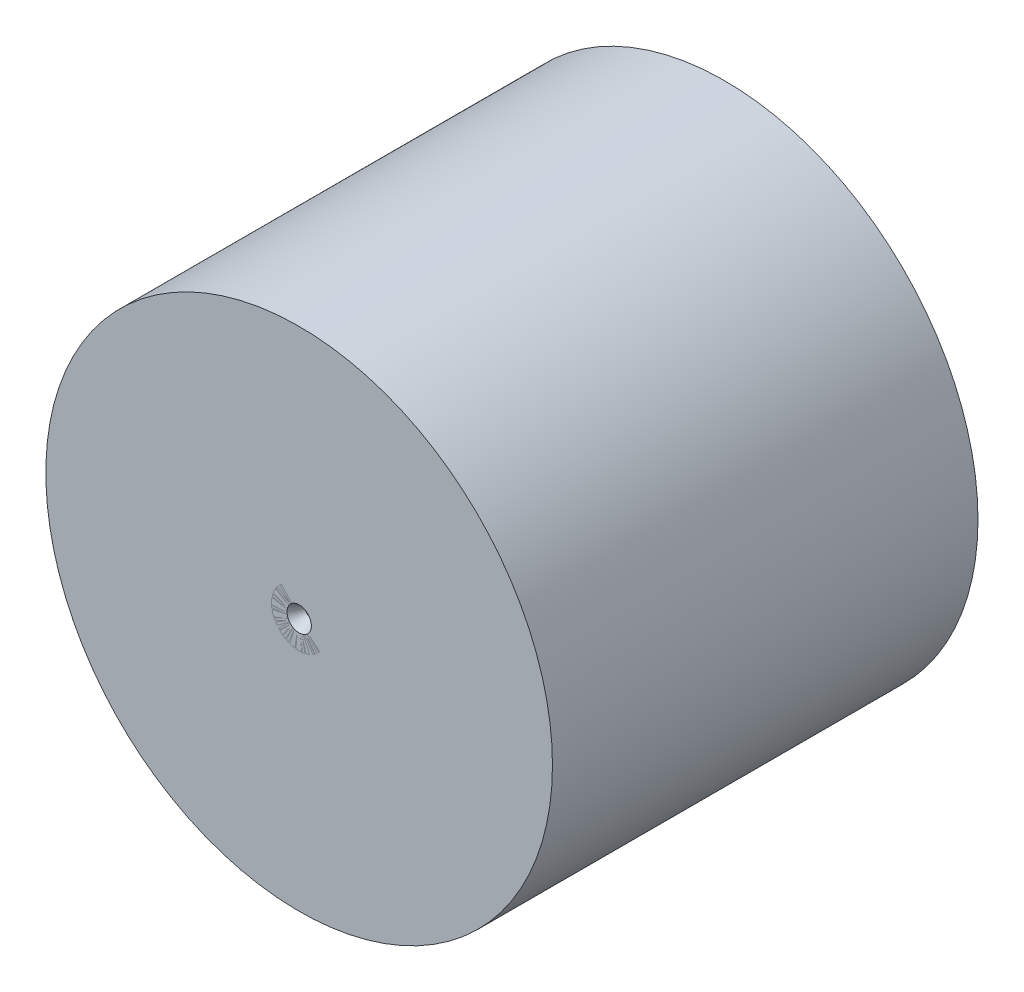
ISO-10303-21;
HEADER;
FILE_DESCRIPTION(('STEP AP214'),'2;1');
FILE_NAME('part.step','',(''),(''),'','','');
FILE_SCHEMA(('AUTOMOTIVE_DESIGN { 1 0 10303 214 1 1 1 1 }'));
ENDSEC;
DATA;
#1=APPLICATION_CONTEXT('core data for automotive mechanical design processes');
#2=APPLICATION_PROTOCOL_DEFINITION('international standard','automotive_design',2000,#1);
#3=PRODUCT_CONTEXT('',#1,'mechanical');
#4=PRODUCT('Part','Part','',(#3));
#5=PRODUCT_RELATED_PRODUCT_CATEGORY('part','',(#4));
#6=PRODUCT_DEFINITION_FORMATION('','',#4);
#7=PRODUCT_DEFINITION_CONTEXT('part definition',#1,'design');
#8=PRODUCT_DEFINITION('design','',#6,#7);
#9=PRODUCT_DEFINITION_SHAPE('','',#8);
#10=(LENGTH_UNIT() NAMED_UNIT(*) SI_UNIT(.MILLI.,.METRE.));
#11=(NAMED_UNIT(*) PLANE_ANGLE_UNIT() SI_UNIT($,.RADIAN.));
#12=(NAMED_UNIT(*) SI_UNIT($,.STERADIAN.) SOLID_ANGLE_UNIT());
#13=UNCERTAINTY_MEASURE_WITH_UNIT(LENGTH_MEASURE(1.E-05),#10,'distance_accuracy_value','');
#14=(GEOMETRIC_REPRESENTATION_CONTEXT(3) GLOBAL_UNCERTAINTY_ASSIGNED_CONTEXT((#13)) GLOBAL_UNIT_ASSIGNED_CONTEXT((#10,
#11,#12)) REPRESENTATION_CONTEXT('',''));
#15=CARTESIAN_POINT('',(0.,0.,0.));
#16=DIRECTION('',(0.,0.,1.));
#17=DIRECTION('',(1.,0.,0.));
#18=AXIS2_PLACEMENT_3D('',#15,#16,#17);
#19=CARTESIAN_POINT('',(0.,0.,-165.644610179245));
#20=DIRECTION('',(0.,0.,1.));
#21=DIRECTION('',(1.,0.,0.));
#22=AXIS2_PLACEMENT_3D('',#19,#20,#21);
#23=CYLINDRICAL_SURFACE('',#22,57.15);
#24=CARTESIAN_POINT('',(0.,0.,-2.));
#25=DIRECTION('',(0.,0.,1.));
#26=DIRECTION('',(1.,0.,0.));
#27=AXIS2_PLACEMENT_3D('',#24,#25,#26);
#28=CIRCLE('',#27,57.15);
#29=CARTESIAN_POINT('',(57.15,0.,-2.));
#30=VERTEX_POINT('',#29);
#31=EDGE_CURVE('E76',#30,#30,#28,.F.);
#32=CARTESIAN_POINT('',(0.,0.,93.9999996618));
#33=DIRECTION('',(0.,0.,1.));
#34=DIRECTION('',(1.,0.,0.));
#35=AXIS2_PLACEMENT_3D('',#32,#33,#34);
#36=CIRCLE('',#35,57.15);
#37=CARTESIAN_POINT('',(57.15,0.,93.9999996618));
#38=VERTEX_POINT('',#37);
#39=EDGE_CURVE('E14',#38,#38,#36,.F.);
#40=CARTESIAN_POINT('',(57.15,0.,-2.));
#41=CARTESIAN_POINT('',(57.15,0.,-1.00000000352291));
#42=CARTESIAN_POINT('',(57.15,0.,-7.04582681261556E-09));
#43=CARTESIAN_POINT('',(57.15,0.,1.99999998590834));
#44=CARTESIAN_POINT('',(57.15,0.,2.99999998238542));
#45=CARTESIAN_POINT('',(57.15,0.,4.99999997533958));
#46=CARTESIAN_POINT('',(57.15,0.,5.99999997181667));
#47=CARTESIAN_POINT('',(57.15,0.,7.99999996477084));
#48=CARTESIAN_POINT('',(57.15,0.,8.99999996124791));
#49=CARTESIAN_POINT('',(57.15,0.,10.9999999542021));
#50=CARTESIAN_POINT('',(57.15,0.,11.9999999506792));
#51=CARTESIAN_POINT('',(57.15,0.,13.9999999436333));
#52=CARTESIAN_POINT('',(57.15,0.,14.9999999401104));
#53=CARTESIAN_POINT('',(57.15,0.,16.9999999330646));
#54=CARTESIAN_POINT('',(57.15,0.,17.9999999295417));
#55=CARTESIAN_POINT('',(57.15,0.,19.9999999224958));
#56=CARTESIAN_POINT('',(57.15,0.,20.9999999189729));
#57=CARTESIAN_POINT('',(57.15,0.,22.9999999119271));
#58=CARTESIAN_POINT('',(57.15,0.,23.9999999084042));
#59=CARTESIAN_POINT('',(57.15,0.,25.9999999013584));
#60=CARTESIAN_POINT('',(57.15,0.,26.9999998978354));
#61=CARTESIAN_POINT('',(57.15,0.,28.9999998907896));
#62=CARTESIAN_POINT('',(57.15,0.,29.9999998872667));
#63=CARTESIAN_POINT('',(57.15,0.,31.9999998802209));
#64=CARTESIAN_POINT('',(57.15,0.,32.9999998766979));
#65=CARTESIAN_POINT('',(57.15,0.,34.9999998696521));
#66=CARTESIAN_POINT('',(57.15,0.,35.9999998661292));
#67=CARTESIAN_POINT('',(57.15,0.,37.9999998590834));
#68=CARTESIAN_POINT('',(57.15,0.,38.9999998555604));
#69=CARTESIAN_POINT('',(57.15,0.,40.9999998485146));
#70=CARTESIAN_POINT('',(57.15,0.,41.9999998449917));
#71=CARTESIAN_POINT('',(57.15,0.,43.9999998379459));
#72=CARTESIAN_POINT('',(57.15,0.,44.999999834423));
#73=CARTESIAN_POINT('',(57.15,0.,46.9999998273771));
#74=CARTESIAN_POINT('',(57.15,0.,47.9999998238542));
#75=CARTESIAN_POINT('',(57.15,0.,49.9999998168084));
#76=CARTESIAN_POINT('',(57.15,0.,50.9999998132854));
#77=CARTESIAN_POINT('',(57.15,0.,52.9999998062396));
#78=CARTESIAN_POINT('',(57.15,0.,53.9999998027167));
#79=CARTESIAN_POINT('',(57.15,0.,55.9999997956709));
#80=CARTESIAN_POINT('',(57.15,0.,56.9999997921479));
#81=CARTESIAN_POINT('',(57.15,0.,58.9999997851021));
#82=CARTESIAN_POINT('',(57.15,0.,59.9999997815792));
#83=CARTESIAN_POINT('',(57.15,0.,61.9999997745334));
#84=CARTESIAN_POINT('',(57.15,0.,62.9999997710105));
#85=CARTESIAN_POINT('',(57.15,0.,64.9999997639646));
#86=CARTESIAN_POINT('',(57.15,0.,65.9999997604417));
#87=CARTESIAN_POINT('',(57.15,0.,67.9999997533959));
#88=CARTESIAN_POINT('',(57.15,0.,68.999999749873));
#89=CARTESIAN_POINT('',(57.15,0.,70.9999997428271));
#90=CARTESIAN_POINT('',(57.15,0.,71.9999997393042));
#91=CARTESIAN_POINT('',(57.15,0.,73.9999997322584));
#92=CARTESIAN_POINT('',(57.15,0.,74.9999997287355));
#93=CARTESIAN_POINT('',(57.15,0.,76.9999997216896));
#94=CARTESIAN_POINT('',(57.15,0.,77.9999997181667));
#95=CARTESIAN_POINT('',(57.15,0.,79.9999997111209));
#96=CARTESIAN_POINT('',(57.15,0.,80.999999707598));
#97=CARTESIAN_POINT('',(57.15,0.,82.9999997005521));
#98=CARTESIAN_POINT('',(57.15,0.,83.9999996970292));
#99=CARTESIAN_POINT('',(57.15,0.,85.9999996899834));
#100=CARTESIAN_POINT('',(57.15,0.,86.9999996864605));
#101=CARTESIAN_POINT('',(57.15,0.,88.9999996794146));
#102=CARTESIAN_POINT('',(57.15,0.,89.9999996758917));
#103=CARTESIAN_POINT('',(57.15,0.,91.9999996688459));
#104=CARTESIAN_POINT('',(57.15,0.,92.9999996653229));
#105=CARTESIAN_POINT('',(57.15,0.,93.9999996618));
#106=B_SPLINE_CURVE_WITH_KNOTS('',3,(#40,#41,#42,#43,#44,#45,#46,#47,#48,#49,#50,#51,#52,#53,
#54,#55,#56,#57,#58,#59,#60,#61,#62,#63,#64,#65,#66,#67,#68,#69,#70,#71,#72,#73,#74,#75,#76,#77,
#78,#79,#80,#81,#82,#83,#84,#85,#86,#87,#88,#89,#90,#91,#92,#93,#94,#95,#96,#97,#98,#99,#100,
#101,#102,#103,#104,#105),.UNSPECIFIED.,.F.,.F.,(4,2,2,2,2,2,2,2,2,2,2,2,2,2,2,2,2,2,2,2,2,2,2,
2,2,2,2,2,2,2,2,2,4),(0.,2.99999998943126,5.9999999788625,8.99999996829376,11.999999957725,
14.9999999471563,17.9999999365875,20.9999999260188,23.99999991545,26.9999999048813,
29.9999998943125,32.9999998837438,35.999999873175,38.9999998626063,41.9999998520375,
44.9999998414688,47.9999998309,50.9999998203313,53.9999998097625,56.9999997991938,
59.999999788625,62.9999997780563,65.9999997674876,68.9999997569188,71.99999974635,
74.9999997357813,77.9999997252125,80.9999997146438,83.9999997040751,86.9999996935063,
89.9999996829376,92.9999996723688,95.9999996618),.UNSPECIFIED.);
#107=EDGE_CURVE('BSEAM68',#30,#38,#106,.T.);
#108=ORIENTED_EDGE('',*,*,#31,.F.);
#109=ORIENTED_EDGE('',*,*,#39,.T.);
#110=ORIENTED_EDGE('',*,*,#107,.T.);
#111=ORIENTED_EDGE('',*,*,#107,.F.);
#112=EDGE_LOOP('',(#108,#110,#109,#111));
#113=FACE_BOUND('',#112,.T.);
#114=ADVANCED_FACE('F68',(#113),#23,.T.);
#115=CARTESIAN_POINT('',(0.,0.,-2.));
#116=DIRECTION('',(0.,0.,1.));
#117=DIRECTION('',(1.,0.,0.));
#118=AXIS2_PLACEMENT_3D('',#115,#116,#117);
#119=PLANE('',#118);
#120=ORIENTED_EDGE('',*,*,#31,.T.);
#121=EDGE_LOOP('',(#120));
#122=FACE_BOUND('',#121,.T.);
#123=ADVANCED_FACE('F107',(#122),#119,.F.);
#124=CARTESIAN_POINT('',(0.,0.,93.9999996618));
#125=DIRECTION('',(0.,0.,1.));
#126=DIRECTION('',(1.,0.,0.));
#127=AXIS2_PLACEMENT_3D('',#124,#125,#126);
#128=PLANE('',#127);
#129=ORIENTED_EDGE('',*,*,#39,.F.);
#130=EDGE_LOOP('',(#129));
#131=FACE_BOUND('',#130,.T.);
#132=CARTESIAN_POINT('',(0.,0.,93.9999996618));
#133=DIRECTION('',(0.,0.,1.));
#134=DIRECTION('',(1.,0.,0.));
#135=AXIS2_PLACEMENT_3D('',#132,#133,#134);
#136=CIRCLE('',#135,2.75);
#137=CARTESIAN_POINT('',(2.75,0.,93.9999996618));
#138=VERTEX_POINT('',#137);
#139=EDGE_CURVE('E96',#138,#138,#136,.T.);
#140=ORIENTED_EDGE('',*,*,#139,.F.);
#141=EDGE_LOOP('',(#140));
#142=FACE_BOUND('',#141,.T.);
#143=ADVANCED_FACE('F70',(#131,#142),#128,.T.);
#144=CARTESIAN_POINT('',(0.,0.,88.9999996618));
#145=DIRECTION('',(0.,0.,1.));
#146=DIRECTION('',(1.,0.,0.));
#147=AXIS2_PLACEMENT_3D('',#144,#145,#146);
#148=CONICAL_SURFACE('',#147,1.19999999999999,1.02974425867665);
#149=CARTESIAN_POINT('',(0.,0.,88.2789669189669));
#150=VERTEX_POINT('',#149);
#151=VERTEX_LOOP('',#150);
#152=FACE_BOUND('',#151,.T.);
#153=CARTESIAN_POINT('',(0.,0.,88.9999996618));
#154=DIRECTION('',(0.,0.,1.));
#155=DIRECTION('',(1.,0.,0.));
#156=AXIS2_PLACEMENT_3D('',#153,#154,#155);
#157=CIRCLE('',#156,1.19999999999999);
#158=CARTESIAN_POINT('',(1.19999999999999,0.,88.9999996618));
#159=VERTEX_POINT('',#158);
#160=EDGE_CURVE('E86',#159,#159,#157,.T.);
#161=ORIENTED_EDGE('',*,*,#160,.T.);
#162=EDGE_LOOP('',(#161));
#163=FACE_BOUND('',#162,.T.);
#164=ADVANCED_FACE('F79',(#152,#163),#148,.F.);
#165=CARTESIAN_POINT('',(0.,0.,93.9999996618));
#166=DIRECTION('',(0.,0.,1.));
#167=DIRECTION('',(1.,0.,0.));
#168=AXIS2_PLACEMENT_3D('',#165,#166,#167);
#169=CYLINDRICAL_SURFACE('',#168,1.19999999999999);
#170=ORIENTED_EDGE('',*,*,#160,.F.);
#171=EDGE_LOOP('',(#170));
#172=FACE_BOUND('',#171,.T.);
#173=CARTESIAN_POINT('',(0.,0.,91.3153209100683));
#174=DIRECTION('',(0.,0.,1.));
#175=DIRECTION('',(1.,0.,0.));
#176=AXIS2_PLACEMENT_3D('',#173,#174,#175);
#177=CIRCLE('',#176,1.2);
#178=CARTESIAN_POINT('',(1.2,0.,91.3153209100683));
#179=VERTEX_POINT('',#178);
#180=EDGE_CURVE('E89',#179,#179,#177,.T.);
#181=ORIENTED_EDGE('',*,*,#180,.T.);
#182=EDGE_LOOP('',(#181));
#183=FACE_BOUND('',#182,.T.);
#184=ADVANCED_FACE('F82',(#172,#183),#169,.F.);
#185=CARTESIAN_POINT('',(0.,0.,93.9999996618));
#186=DIRECTION('',(0.,0.,1.));
#187=DIRECTION('',(1.,0.,0.));
#188=AXIS2_PLACEMENT_3D('',#185,#186,#187);
#189=CONICAL_SURFACE('',#188,2.75,0.523598775598297);
#190=ORIENTED_EDGE('',*,*,#180,.F.);
#191=EDGE_LOOP('',(#190));
#192=FACE_BOUND('',#191,.T.);
#193=ORIENTED_EDGE('',*,*,#139,.T.);
#194=EDGE_LOOP('',(#193));
#195=FACE_BOUND('',#194,.T.);
#196=ADVANCED_FACE('F104',(#192,#195),#189,.F.);
#197=CLOSED_SHELL('',(#114,#123,#143,#164,#184,#196));
#198=MANIFOLD_SOLID_BREP('B2_NOT_SHOWN',#197);
#199=CARTESIAN_POINT('',(0.,0.,93.9999996618));
#200=DIRECTION('',(0.,0.,1.));
#201=DIRECTION('',(1.,0.,0.));
#202=AXIS2_PLACEMENT_3D('',#199,#200,#201);
#203=PLANE('',#202);
#204=CARTESIAN_POINT('',(0.,0.,93.9999996618));
#205=DIRECTION('',(0.,0.,1.));
#206=DIRECTION('',(1.,0.,0.));
#207=AXIS2_PLACEMENT_3D('',#204,#205,#206);
#208=CIRCLE('',#207,2.75);
#209=CARTESIAN_POINT('',(2.75,0.,93.9999996618));
#210=VERTEX_POINT('',#209);
#211=EDGE_CURVE('E220',#210,#210,#208,.T.);
#212=ORIENTED_EDGE('',*,*,#211,.F.);
#213=EDGE_LOOP('',(#212));
#214=FACE_BOUND('',#213,.T.);
#215=CARTESIAN_POINT('',(0.,0.,93.9999996618));
#216=DIRECTION('',(0.,0.,1.));
#217=DIRECTION('',(1.,0.,0.));
#218=AXIS2_PLACEMENT_3D('',#215,#216,#217);
#219=CIRCLE('',#218,6.24999997775);
#220=CARTESIAN_POINT('',(6.24999997775,0.,93.9999996618));
#221=VERTEX_POINT('',#220);
#222=EDGE_CURVE('E66',#221,#221,#219,.T.);
#223=ORIENTED_EDGE('',*,*,#222,.T.);
#224=EDGE_LOOP('',(#223));
#225=FACE_BOUND('',#224,.T.);
#226=ADVANCED_FACE('F189',(#214,#225),#203,.T.);
#227=CARTESIAN_POINT('',(0.,0.,24.999999911));
#228=DIRECTION('',(0.,0.,1.));
#229=DIRECTION('',(1.,0.,0.));
#230=AXIS2_PLACEMENT_3D('',#227,#228,#229);
#231=PLANE('',#230);
#232=CARTESIAN_POINT('',(0.,0.,24.999999911));
#233=DIRECTION('',(0.,0.,1.));
#234=DIRECTION('',(1.,0.,0.));
#235=AXIS2_PLACEMENT_3D('',#232,#233,#234);
#236=CIRCLE('',#235,22.3588115081785);
#237=CARTESIAN_POINT('',(22.3588115081785,0.,24.999999911));
#238=VERTEX_POINT('',#237);
#239=EDGE_CURVE('E227',#238,#238,#236,.T.);
#240=ORIENTED_EDGE('',*,*,#239,.F.);
#241=EDGE_LOOP('',(#240));
#242=FACE_BOUND('',#241,.T.);
#243=CARTESIAN_POINT('',(0.,0.,24.9999999110001));
#244=DIRECTION('',(0.,0.,-1.));
#245=DIRECTION('',(-1.,0.,0.));
#246=AXIS2_PLACEMENT_3D('',#243,#244,#245);
#247=CIRCLE('',#246,28.7499998976501);
#248=CARTESIAN_POINT('',(-28.7499998976501,0.,24.9999999110001));
#249=VERTEX_POINT('',#248);
#250=EDGE_CURVE('E241',#249,#249,#247,.T.);
#251=ORIENTED_EDGE('',*,*,#250,.F.);
#252=EDGE_LOOP('',(#251));
#253=FACE_BOUND('',#252,.T.);
#254=ADVANCED_FACE('F269',(#242,#253),#231,.T.);
#255=CARTESIAN_POINT('',(0.,0.,23.7499999154499));
#256=DIRECTION('',(0.,0.,-1.));
#257=DIRECTION('',(-1.,0.,0.));
#258=AXIS2_PLACEMENT_3D('',#255,#256,#257);
#259=CONICAL_SURFACE('',#258,29.9999998931999,0.785398163397298);
#260=CARTESIAN_POINT('',(0.,0.,23.74999991545));
#261=DIRECTION('',(0.,0.,1.));
#262=DIRECTION('',(1.,0.,0.));
#263=AXIS2_PLACEMENT_3D('',#260,#261,#262);
#264=CIRCLE('',#263,29.9999998932);
#265=CARTESIAN_POINT('',(29.9999998932,0.,23.74999991545));
#266=VERTEX_POINT('',#265);
#267=EDGE_CURVE('E236',#266,#266,#264,.F.);
#268=ORIENTED_EDGE('',*,*,#267,.F.);
#269=EDGE_LOOP('',(#268));
#270=FACE_BOUND('',#269,.T.);
#271=ORIENTED_EDGE('',*,*,#250,.T.);
#272=EDGE_LOOP('',(#271));
#273=FACE_BOUND('',#272,.T.);
#274=ADVANCED_FACE('F651',(#270,#273),#259,.T.);
#275=CARTESIAN_POINT('',(0.,0.,4.9999999822));
#276=DIRECTION('',(0.,0.,1.));
#277=DIRECTION('',(1.,0.,0.));
#278=AXIS2_PLACEMENT_3D('',#275,#276,#277);
#279=CYLINDRICAL_SURFACE('',#278,29.9999998932);
#280=CARTESIAN_POINT('',(0.,0.,12.74999996173));
#281=DIRECTION('',(0.,0.,1.));
#282=DIRECTION('',(1.,0.,0.));
#283=AXIS2_PLACEMENT_3D('',#280,#281,#282);
#284=CIRCLE('',#283,29.9999998932);
#285=CARTESIAN_POINT('',(29.9999998932,0.,12.74999996173));
#286=VERTEX_POINT('',#285);
#287=EDGE_CURVE('E196',#286,#286,#284,.T.);
#288=ORIENTED_EDGE('',*,*,#287,.T.);
#289=EDGE_LOOP('',(#288));
#290=FACE_BOUND('',#289,.T.);
#291=ORIENTED_EDGE('',*,*,#267,.T.);
#292=EDGE_LOOP('',(#291));
#293=FACE_BOUND('',#292,.T.);
#294=ADVANCED_FACE('F645',(#290,#293),#279,.T.);
#295=CARTESIAN_POINT('',(-51.874999815325,-6.30476008401506,10.74999996173));
#296=DIRECTION('',(0.,0.,1.));
#297=DIRECTION('',(1.,0.,0.));
#298=AXIS2_PLACEMENT_3D('',#295,#296,#297);
#299=PLANE('',#298);
#300=CARTESIAN_POINT('',(0.,0.,10.74999996173));
#301=DIRECTION('',(0.,0.,1.));
#302=DIRECTION('',(1.,0.,0.));
#303=AXIS2_PLACEMENT_3D('',#300,#301,#302);
#304=CIRCLE('',#303,31.9999998932);
#305=CARTESIAN_POINT('',(31.9999998932,0.,10.74999996173));
#306=VERTEX_POINT('',#305);
#307=EDGE_CURVE('E240',#306,#306,#304,.F.);
#308=ORIENTED_EDGE('',*,*,#307,.T.);
#309=EDGE_LOOP('',(#308));
#310=FACE_BOUND('',#309,.T.);
#311=CARTESIAN_POINT('',(0.,0.,10.74999996173));
#312=DIRECTION('',(0.,0.,1.));
#313=DIRECTION('',(1.,0.,0.));
#314=AXIS2_PLACEMENT_3D('',#311,#312,#313);
#315=CIRCLE('',#314,57.15);
#316=CARTESIAN_POINT('',(57.15,0.,10.74999996173));
#317=VERTEX_POINT('',#316);
#318=EDGE_CURVE('E210',#317,#317,#315,.T.);
#319=ORIENTED_EDGE('',*,*,#318,.T.);
#320=EDGE_LOOP('',(#319));
#321=FACE_BOUND('',#320,.T.);
#322=ADVANCED_FACE('F635',(#310,#321),#299,.T.);
#323=CARTESIAN_POINT('',(0.,0.,12.74999996173));
#324=DIRECTION('',(0.,0.,1.));
#325=DIRECTION('',(1.,0.,0.));
#326=AXIS2_PLACEMENT_3D('',#323,#324,#325);
#327=TOROIDAL_SURFACE('',#326,31.9999998932,2.);
#328=ORIENTED_EDGE('',*,*,#287,.F.);
#329=EDGE_LOOP('',(#328));
#330=FACE_BOUND('',#329,.T.);
#331=ORIENTED_EDGE('',*,*,#307,.F.);
#332=EDGE_LOOP('',(#331));
#333=FACE_BOUND('',#332,.T.);
#334=ADVANCED_FACE('F277',(#330,#333),#327,.F.);
#335=CARTESIAN_POINT('',(0.,0.,110.240268751019));
#336=DIRECTION('',(0.,0.,-1.));
#337=DIRECTION('',(-1.,0.,0.));
#338=AXIS2_PLACEMENT_3D('',#335,#336,#337);
#339=CYLINDRICAL_SURFACE('',#338,22.3588115081785);
#340=ORIENTED_EDGE('',*,*,#239,.T.);
#341=EDGE_LOOP('',(#340));
#342=FACE_BOUND('',#341,.T.);
#343=CARTESIAN_POINT('',(0.,0.,46.9999998042));
#344=DIRECTION('',(0.,0.,1.));
#345=DIRECTION('',(1.,0.,0.));
#346=AXIS2_PLACEMENT_3D('',#343,#344,#345);
#347=CIRCLE('',#346,22.3588115081785);
#348=CARTESIAN_POINT('',(22.3588115081785,0.,46.9999998042));
#349=VERTEX_POINT('',#348);
#350=EDGE_CURVE('E231',#349,#349,#347,.T.);
#351=ORIENTED_EDGE('',*,*,#350,.F.);
#352=EDGE_LOOP('',(#351));
#353=FACE_BOUND('',#352,.T.);
#354=ADVANCED_FACE('F647',(#342,#353),#339,.T.);
#355=CARTESIAN_POINT('',(0.,0.,46.9999998042));
#356=DIRECTION('',(0.,0.,1.));
#357=DIRECTION('',(1.,0.,0.));
#358=AXIS2_PLACEMENT_3D('',#355,#356,#357);
#359=CYLINDRICAL_SURFACE('',#358,6.24999997775);
#360=ORIENTED_EDGE('',*,*,#222,.F.);
#361=EDGE_LOOP('',(#360));
#362=FACE_BOUND('',#361,.T.);
#363=CARTESIAN_POINT('',(0.,0.,47.9999998042));
#364=DIRECTION('',(0.,0.,1.));
#365=DIRECTION('',(1.,0.,0.));
#366=AXIS2_PLACEMENT_3D('',#363,#364,#365);
#367=CIRCLE('',#366,6.24999997775);
#368=CARTESIAN_POINT('',(6.24999997775,0.,47.9999998042));
#369=VERTEX_POINT('',#368);
#370=EDGE_CURVE('E235',#369,#369,#367,.T.);
#371=ORIENTED_EDGE('',*,*,#370,.T.);
#372=EDGE_LOOP('',(#371));
#373=FACE_BOUND('',#372,.T.);
#374=ADVANCED_FACE('F275',(#362,#373),#359,.T.);
#375=CARTESIAN_POINT('',(0.,0.,47.9999998042));
#376=DIRECTION('',(0.,0.,1.));
#377=DIRECTION('',(1.,0.,0.));
#378=AXIS2_PLACEMENT_3D('',#375,#376,#377);
#379=TOROIDAL_SURFACE('',#378,7.24999997775,1.);
#380=ORIENTED_EDGE('',*,*,#370,.F.);
#381=EDGE_LOOP('',(#380));
#382=FACE_BOUND('',#381,.T.);
#383=CARTESIAN_POINT('',(0.,0.,46.9999998042));
#384=DIRECTION('',(0.,0.,1.));
#385=DIRECTION('',(1.,0.,0.));
#386=AXIS2_PLACEMENT_3D('',#383,#384,#385);
#387=CIRCLE('',#386,7.24999997775);
#388=CARTESIAN_POINT('',(7.24999997775,0.,46.9999998042));
#389=VERTEX_POINT('',#388);
#390=EDGE_CURVE('E248',#389,#389,#387,.F.);
#391=ORIENTED_EDGE('',*,*,#390,.F.);
#392=EDGE_LOOP('',(#391));
#393=FACE_BOUND('',#392,.T.);
#394=ADVANCED_FACE('F268',(#382,#393),#379,.F.);
#395=CARTESIAN_POINT('',(0.,0.,46.9999998042));
#396=DIRECTION('',(0.,0.,1.));
#397=DIRECTION('',(1.,0.,0.));
#398=AXIS2_PLACEMENT_3D('',#395,#396,#397);
#399=PLANE('',#398);
#400=ORIENTED_EDGE('',*,*,#390,.T.);
#401=EDGE_LOOP('',(#400));
#402=FACE_BOUND('',#401,.T.);
#403=ORIENTED_EDGE('',*,*,#350,.T.);
#404=EDGE_LOOP('',(#403));
#405=FACE_BOUND('',#404,.T.);
#406=ADVANCED_FACE('F257',(#402,#405),#399,.T.);
#407=CARTESIAN_POINT('',(0.,0.,-165.644610179245));
#408=DIRECTION('',(0.,0.,1.));
#409=DIRECTION('',(1.,0.,0.));
#410=AXIS2_PLACEMENT_3D('',#407,#408,#409);
#411=CYLINDRICAL_SURFACE('',#410,57.15);
#412=CARTESIAN_POINT('',(0.,0.,-2.));
#413=DIRECTION('',(0.,0.,1.));
#414=DIRECTION('',(1.,0.,0.));
#415=AXIS2_PLACEMENT_3D('',#412,#413,#414);
#416=CIRCLE('',#415,57.15);
#417=CARTESIAN_POINT('',(57.15,0.,-2.));
#418=VERTEX_POINT('',#417);
#419=EDGE_CURVE('E216',#418,#418,#416,.F.);
#420=CARTESIAN_POINT('',(57.15,0.,-2.));
#421=CARTESIAN_POINT('',(57.15,0.,-1.86718750039865));
#422=CARTESIAN_POINT('',(57.15,0.,-1.7343750007973));
#423=CARTESIAN_POINT('',(57.15,0.,-1.46875000159459));
#424=CARTESIAN_POINT('',(57.15,0.,-1.33593750199324));
#425=CARTESIAN_POINT('',(57.15,0.,-1.07031250279053));
#426=CARTESIAN_POINT('',(57.15,0.,-0.93750000318917));
#427=CARTESIAN_POINT('',(57.15,0.,-0.671875003986457));
#428=CARTESIAN_POINT('',(57.15,0.,-0.539062504385105));
#429=CARTESIAN_POINT('',(57.15,0.,-0.273437505182402));
#430=CARTESIAN_POINT('',(57.15,0.,-0.14062500558105));
#431=CARTESIAN_POINT('',(57.15,0.,0.124999993621662));
#432=CARTESIAN_POINT('',(57.15,0.,0.257812493223023));
#433=CARTESIAN_POINT('',(57.15,0.,0.523437492425736));
#434=CARTESIAN_POINT('',(57.15,0.,0.656249992027088));
#435=CARTESIAN_POINT('',(57.15,0.,0.921874991229791));
#436=CARTESIAN_POINT('',(57.15,0.,1.05468749083114));
#437=CARTESIAN_POINT('',(57.15,0.,1.32031249003385));
#438=CARTESIAN_POINT('',(57.15,0.,1.4531249896352));
#439=CARTESIAN_POINT('',(57.15,0.,1.7187499888379));
#440=CARTESIAN_POINT('',(57.15,0.,1.85156248843925));
#441=CARTESIAN_POINT('',(57.15,0.,2.11718748764197));
#442=CARTESIAN_POINT('',(57.15,0.,2.24999998724333));
#443=CARTESIAN_POINT('',(57.15,0.,2.51562498644604));
#444=CARTESIAN_POINT('',(57.15,0.,2.64843748604739));
#445=CARTESIAN_POINT('',(57.15,0.,2.91406248525009));
#446=CARTESIAN_POINT('',(57.15,0.,3.04687498485145));
#447=CARTESIAN_POINT('',(57.15,0.,3.31249998405416));
#448=CARTESIAN_POINT('',(57.15,0.,3.44531248365552));
#449=CARTESIAN_POINT('',(57.15,0.,3.71093748285823));
#450=CARTESIAN_POINT('',(57.15,0.,3.84374998245958));
#451=CARTESIAN_POINT('',(57.15,0.,4.10937498166229));
#452=CARTESIAN_POINT('',(57.15,0.,4.24218748126364));
#453=CARTESIAN_POINT('',(57.15,0.,4.50781248046634));
#454=CARTESIAN_POINT('',(57.15,0.,4.64062498006769));
#455=CARTESIAN_POINT('',(57.15,0.,4.9062499792704));
#456=CARTESIAN_POINT('',(57.15,0.,5.03906247887175));
#457=CARTESIAN_POINT('',(57.15,0.,5.30468747807446));
#458=CARTESIAN_POINT('',(57.15,0.,5.43749997767582));
#459=CARTESIAN_POINT('',(57.15,0.,5.70312497687854));
#460=CARTESIAN_POINT('',(57.15,0.,5.83593747647989));
#461=CARTESIAN_POINT('',(57.15,0.,6.10156247568259));
#462=CARTESIAN_POINT('',(57.15,0.,6.23437497528394));
#463=CARTESIAN_POINT('',(57.15,0.,6.49999997448665));
#464=CARTESIAN_POINT('',(57.15,0.,6.63281247408802));
#465=CARTESIAN_POINT('',(57.15,0.,6.89843747329073));
#466=CARTESIAN_POINT('',(57.15,0.,7.03124997289208));
#467=CARTESIAN_POINT('',(57.15,0.,7.29687497209478));
#468=CARTESIAN_POINT('',(57.15,0.,7.42968747169613));
#469=CARTESIAN_POINT('',(57.15,0.,7.69531247089884));
#470=CARTESIAN_POINT('',(57.15,0.,7.82812497050019));
#471=CARTESIAN_POINT('',(57.15,0.,8.09374996970289));
#472=CARTESIAN_POINT('',(57.15,0.,8.22656246930425));
#473=CARTESIAN_POINT('',(57.15,0.,8.49218746850696));
#474=CARTESIAN_POINT('',(57.15,0.,8.62499996810832));
#475=CARTESIAN_POINT('',(57.15,0.,8.89062496731103));
#476=CARTESIAN_POINT('',(57.15,0.,9.02343746691238));
#477=CARTESIAN_POINT('',(57.15,0.,9.28906246611509));
#478=CARTESIAN_POINT('',(57.15,0.,9.42187496571644));
#479=CARTESIAN_POINT('',(57.15,0.,9.68749996491915));
#480=CARTESIAN_POINT('',(57.15,0.,9.82031246452051));
#481=CARTESIAN_POINT('',(57.15,0.,10.0859374637232));
#482=CARTESIAN_POINT('',(57.15,0.,10.2187499633246));
#483=CARTESIAN_POINT('',(57.15,0.,10.4843749625273));
#484=CARTESIAN_POINT('',(57.15,0.,10.6171874621286));
#485=CARTESIAN_POINT('',(57.15,0.,10.74999996173));
#486=B_SPLINE_CURVE_WITH_KNOTS('',3,(#420,#421,#422,#423,#424,#425,#426,#427,#428,#429,#430,
#431,#432,#433,#434,#435,#436,#437,#438,#439,#440,#441,#442,#443,#444,#445,#446,#447,#448,#449,
#450,#451,#452,#453,#454,#455,#456,#457,#458,#459,#460,#461,#462,#463,#464,#465,#466,#467,#468,
#469,#470,#471,#472,#473,#474,#475,#476,#477,#478,#479,#480,#481,#482,#483,#484,#485),
.UNSPECIFIED.,.F.,.F.,(4,2,2,2,2,2,2,2,2,2,2,2,2,2,2,2,2,2,2,2,2,2,2,2,2,2,2,2,2,2,2,2,4),(0.,
0.398437498804055,0.79687499760811,1.19531249641219,1.59374999521625,1.9921874940203,
2.39062499282439,2.78906249162844,3.1874999904325,3.58593748923655,3.98437498804061,
4.38281248684469,4.78124998564874,5.1796874844528,5.57812498325688,5.97656248206094,
6.37499998086499,6.77343747966905,7.1718749784731,7.57031247727719,7.96874997608124,
8.3671874748853,8.76562497368938,9.16406247249343,9.56249997129749,9.96093747010154,
10.3593749689056,10.7578124677097,11.1562499665137,11.5546874653178,11.9531249641219,
12.3515624629259,12.74999996173),.UNSPECIFIED.);
#487=EDGE_CURVE('BSEAM267',#418,#317,#486,.T.);
#488=ORIENTED_EDGE('',*,*,#419,.F.);
#489=ORIENTED_EDGE('',*,*,#318,.F.);
#490=ORIENTED_EDGE('',*,*,#487,.T.);
#491=ORIENTED_EDGE('',*,*,#487,.F.);
#492=EDGE_LOOP('',(#488,#490,#489,#491));
#493=FACE_BOUND('',#492,.T.);
#494=ADVANCED_FACE('F267',(#493),#411,.T.);
#495=CARTESIAN_POINT('',(0.,0.,-2.));
#496=DIRECTION('',(0.,0.,1.));
#497=DIRECTION('',(1.,0.,0.));
#498=AXIS2_PLACEMENT_3D('',#495,#496,#497);
#499=PLANE('',#498);
#500=ORIENTED_EDGE('',*,*,#419,.T.);
#501=EDGE_LOOP('',(#500));
#502=FACE_BOUND('',#501,.T.);
#503=ADVANCED_FACE('F203',(#502),#499,.F.);
#504=CARTESIAN_POINT('',(0.,0.,88.9999996618));
#505=DIRECTION('',(0.,0.,1.));
#506=DIRECTION('',(1.,0.,0.));
#507=AXIS2_PLACEMENT_3D('',#504,#505,#506);
#508=CONICAL_SURFACE('',#507,1.19999999999999,1.02974425867665);
#509=CARTESIAN_POINT('',(0.,0.,88.2789669189669));
#510=VERTEX_POINT('',#509);
#511=VERTEX_LOOP('',#510);
#512=FACE_BOUND('',#511,.T.);
#513=CARTESIAN_POINT('',(0.,0.,88.9999996618));
#514=DIRECTION('',(0.,0.,1.));
#515=DIRECTION('',(1.,0.,0.));
#516=AXIS2_PLACEMENT_3D('',#513,#514,#515);
#517=CIRCLE('',#516,1.19999999999999);
#518=CARTESIAN_POINT('',(1.19999999999999,0.,88.9999996618));
#519=VERTEX_POINT('',#518);
#520=EDGE_CURVE('E207',#519,#519,#517,.T.);
#521=ORIENTED_EDGE('',*,*,#520,.T.);
#522=EDGE_LOOP('',(#521));
#523=FACE_BOUND('',#522,.T.);
#524=ADVANCED_FACE('F199',(#512,#523),#508,.F.);
#525=CARTESIAN_POINT('',(0.,0.,93.9999996618));
#526=DIRECTION('',(0.,0.,1.));
#527=DIRECTION('',(1.,0.,0.));
#528=AXIS2_PLACEMENT_3D('',#525,#526,#527);
#529=CYLINDRICAL_SURFACE('',#528,1.19999999999999);
#530=ORIENTED_EDGE('',*,*,#520,.F.);
#531=EDGE_LOOP('',(#530));
#532=FACE_BOUND('',#531,.T.);
#533=CARTESIAN_POINT('',(0.,0.,91.3153209100683));
#534=DIRECTION('',(0.,0.,1.));
#535=DIRECTION('',(1.,0.,0.));
#536=AXIS2_PLACEMENT_3D('',#533,#534,#535);
#537=CIRCLE('',#536,1.2);
#538=CARTESIAN_POINT('',(1.2,0.,91.3153209100683));
#539=VERTEX_POINT('',#538);
#540=EDGE_CURVE('E211',#539,#539,#537,.T.);
#541=ORIENTED_EDGE('',*,*,#540,.T.);
#542=EDGE_LOOP('',(#541));
#543=FACE_BOUND('',#542,.T.);
#544=ADVANCED_FACE('F202',(#532,#543),#529,.F.);
#545=CARTESIAN_POINT('',(0.,0.,93.9999996618));
#546=DIRECTION('',(0.,0.,1.));
#547=DIRECTION('',(1.,0.,0.));
#548=AXIS2_PLACEMENT_3D('',#545,#546,#547);
#549=CONICAL_SURFACE('',#548,2.75,0.523598775598297);
#550=ORIENTED_EDGE('',*,*,#540,.F.);
#551=EDGE_LOOP('',(#550));
#552=FACE_BOUND('',#551,.T.);
#553=ORIENTED_EDGE('',*,*,#211,.T.);
#554=EDGE_LOOP('',(#553));
#555=FACE_BOUND('',#554,.T.);
#556=ADVANCED_FACE('F888',(#552,#555),#549,.F.);
#557=CLOSED_SHELL('',(#226,#254,#274,#294,#322,#334,#354,#374,#394,#406,#494,#503,#524,#544,#556));
#558=MANIFOLD_SOLID_BREP('B8',#557);
#559=ADVANCED_BREP_SHAPE_REPRESENTATION('',(#18,#198,#558),#14);
#560=SHAPE_DEFINITION_REPRESENTATION(#9,#559);
ENDSEC;
END-ISO-10303-21;
